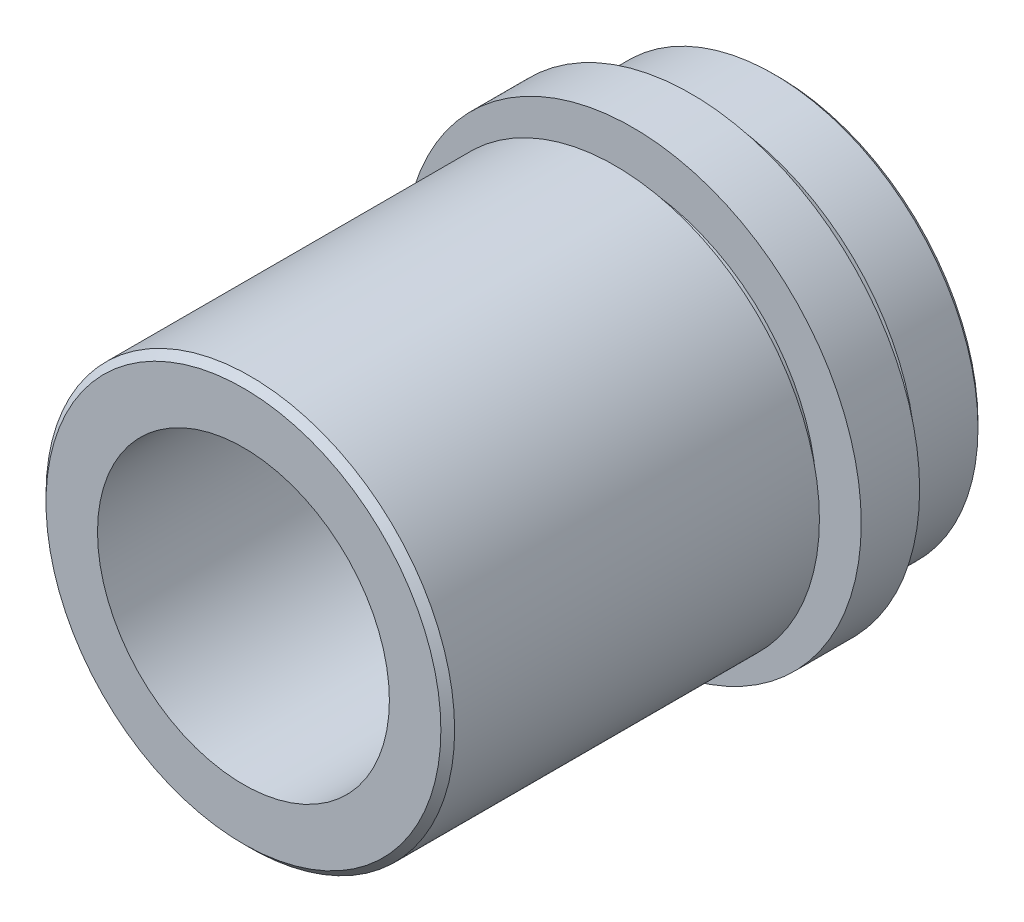
ISO-10303-21;
HEADER;
FILE_DESCRIPTION(('STEP AP214'),'2;1');
FILE_NAME('part.step','',(''),(''),'','','');
FILE_SCHEMA(('AUTOMOTIVE_DESIGN { 1 0 10303 214 1 1 1 1 }'));
ENDSEC;
DATA;
#1=APPLICATION_CONTEXT('core data for automotive mechanical design processes');
#2=APPLICATION_PROTOCOL_DEFINITION('international standard','automotive_design',2000,#1);
#3=PRODUCT_CONTEXT('',#1,'mechanical');
#4=PRODUCT('Part','Part','',(#3));
#5=PRODUCT_RELATED_PRODUCT_CATEGORY('part','',(#4));
#6=PRODUCT_DEFINITION_FORMATION('','',#4);
#7=PRODUCT_DEFINITION_CONTEXT('part definition',#1,'design');
#8=PRODUCT_DEFINITION('design','',#6,#7);
#9=PRODUCT_DEFINITION_SHAPE('','',#8);
#10=(LENGTH_UNIT() NAMED_UNIT(*) SI_UNIT(.MILLI.,.METRE.));
#11=(NAMED_UNIT(*) PLANE_ANGLE_UNIT() SI_UNIT($,.RADIAN.));
#12=(NAMED_UNIT(*) SI_UNIT($,.STERADIAN.) SOLID_ANGLE_UNIT());
#13=UNCERTAINTY_MEASURE_WITH_UNIT(LENGTH_MEASURE(1.E-05),#10,'distance_accuracy_value','');
#14=(GEOMETRIC_REPRESENTATION_CONTEXT(3) GLOBAL_UNCERTAINTY_ASSIGNED_CONTEXT((#13)) GLOBAL_UNIT_ASSIGNED_CONTEXT((#10,
#11,#12)) REPRESENTATION_CONTEXT('',''));
#15=CARTESIAN_POINT('',(0.,0.,0.));
#16=DIRECTION('',(0.,0.,1.));
#17=DIRECTION('',(1.,0.,0.));
#18=AXIS2_PLACEMENT_3D('',#15,#16,#17);
#19=CARTESIAN_POINT('',(0.,0.,0.));
#20=DIRECTION('',(0.,0.,1.));
#21=DIRECTION('',(1.,0.,0.));
#22=AXIS2_PLACEMENT_3D('',#19,#20,#21);
#23=CYLINDRICAL_SURFACE('',#22,21.);
#24=CARTESIAN_POINT('',(0.,0.,0.5));
#25=DIRECTION('',(0.,0.,1.));
#26=DIRECTION('',(1.,0.,0.));
#27=AXIS2_PLACEMENT_3D('',#24,#25,#26);
#28=CIRCLE('',#27,21.);
#29=CARTESIAN_POINT('',(21.,0.,0.5));
#30=VERTEX_POINT('',#29);
#31=EDGE_CURVE('E74',#30,#30,#28,.T.);
#32=ORIENTED_EDGE('',*,*,#31,.T.);
#33=EDGE_LOOP('',(#32));
#34=FACE_BOUND('',#33,.T.);
#35=CARTESIAN_POINT('',(0.,0.,6.9));
#36=DIRECTION('',(0.,0.,1.));
#37=DIRECTION('',(1.,0.,0.));
#38=AXIS2_PLACEMENT_3D('',#35,#36,#37);
#39=CIRCLE('',#38,21.);
#40=CARTESIAN_POINT('',(21.,0.,6.9));
#41=VERTEX_POINT('',#40);
#42=EDGE_CURVE('E83',#41,#41,#39,.T.);
#43=ORIENTED_EDGE('',*,*,#42,.F.);
#44=EDGE_LOOP('',(#43));
#45=FACE_BOUND('',#44,.T.);
#46=ADVANCED_FACE('F33',(#34,#45),#23,.T.);
#47=CARTESIAN_POINT('',(0.,21.,0.));
#48=DIRECTION('',(0.,0.,1.));
#49=DIRECTION('',(1.,0.,0.));
#50=AXIS2_PLACEMENT_3D('',#47,#48,#49);
#51=PLANE('',#50);
#52=CARTESIAN_POINT('',(0.,0.,0.));
#53=DIRECTION('',(0.,0.,1.));
#54=DIRECTION('',(1.,0.,0.));
#55=AXIS2_PLACEMENT_3D('',#52,#53,#54);
#56=CIRCLE('',#55,16.);
#57=CARTESIAN_POINT('',(16.,0.,0.));
#58=VERTEX_POINT('',#57);
#59=EDGE_CURVE('E68',#58,#58,#56,.T.);
#60=ORIENTED_EDGE('',*,*,#59,.T.);
#61=EDGE_LOOP('',(#60));
#62=FACE_BOUND('',#61,.T.);
#63=CARTESIAN_POINT('',(0.,0.,0.));
#64=DIRECTION('',(0.,0.,1.));
#65=DIRECTION('',(1.,0.,0.));
#66=AXIS2_PLACEMENT_3D('',#63,#64,#65);
#67=CIRCLE('',#66,20.5);
#68=CARTESIAN_POINT('',(20.5,0.,0.));
#69=VERTEX_POINT('',#68);
#70=EDGE_CURVE('E71',#69,#69,#67,.T.);
#71=ORIENTED_EDGE('',*,*,#70,.F.);
#72=EDGE_LOOP('',(#71));
#73=FACE_BOUND('',#72,.T.);
#74=ADVANCED_FACE('F91',(#62,#73),#51,.F.);
#75=CARTESIAN_POINT('',(0.,0.,55.));
#76=DIRECTION('',(0.,0.,-1.));
#77=DIRECTION('',(-1.,0.,0.));
#78=AXIS2_PLACEMENT_3D('',#75,#76,#77);
#79=PLANE('',#78);
#80=CARTESIAN_POINT('',(0.,0.,55.));
#81=DIRECTION('',(0.,0.,1.));
#82=DIRECTION('',(1.,0.,0.));
#83=AXIS2_PLACEMENT_3D('',#80,#81,#82);
#84=CIRCLE('',#83,20.2928932188134);
#85=CARTESIAN_POINT('',(20.2928932188134,0.,55.));
#86=VERTEX_POINT('',#85);
#87=EDGE_CURVE('E48',#86,#86,#84,.T.);
#88=ORIENTED_EDGE('',*,*,#87,.T.);
#89=EDGE_LOOP('',(#88));
#90=FACE_BOUND('',#89,.T.);
#91=CARTESIAN_POINT('',(0.,0.,55.));
#92=DIRECTION('',(0.,0.,1.));
#93=DIRECTION('',(1.,0.,0.));
#94=AXIS2_PLACEMENT_3D('',#91,#92,#93);
#95=CIRCLE('',#94,15.);
#96=CARTESIAN_POINT('',(15.,0.,55.));
#97=VERTEX_POINT('',#96);
#98=EDGE_CURVE('E62',#97,#97,#95,.T.);
#99=ORIENTED_EDGE('',*,*,#98,.F.);
#100=EDGE_LOOP('',(#99));
#101=FACE_BOUND('',#100,.T.);
#102=ADVANCED_FACE('F97',(#90,#101),#79,.F.);
#103=CARTESIAN_POINT('',(0.,23.5,9.));
#104=DIRECTION('',(0.,0.,1.));
#105=DIRECTION('',(1.,0.,0.));
#106=AXIS2_PLACEMENT_3D('',#103,#104,#105);
#107=PLANE('',#106);
#108=CARTESIAN_POINT('',(0.,0.,9.));
#109=DIRECTION('',(0.,0.,1.));
#110=DIRECTION('',(1.,0.,0.));
#111=AXIS2_PLACEMENT_3D('',#108,#109,#110);
#112=CIRCLE('',#111,23.5);
#113=CARTESIAN_POINT('',(23.5,0.,9.));
#114=VERTEX_POINT('',#113);
#115=EDGE_CURVE('E40',#114,#114,#112,.T.);
#116=ORIENTED_EDGE('',*,*,#115,.F.);
#117=EDGE_LOOP('',(#116));
#118=FACE_BOUND('',#117,.T.);
#119=CARTESIAN_POINT('',(0.,0.,9.));
#120=DIRECTION('',(0.,0.,1.));
#121=DIRECTION('',(1.,0.,0.));
#122=AXIS2_PLACEMENT_3D('',#119,#120,#121);
#123=CIRCLE('',#122,18.9);
#124=CARTESIAN_POINT('',(18.9,0.,9.));
#125=VERTEX_POINT('',#124);
#126=EDGE_CURVE('E77',#125,#125,#123,.T.);
#127=ORIENTED_EDGE('',*,*,#126,.T.);
#128=EDGE_LOOP('',(#127));
#129=FACE_BOUND('',#128,.T.);
#130=ADVANCED_FACE('F118',(#118,#129),#107,.F.);
#131=CARTESIAN_POINT('',(0.,0.,15.));
#132=DIRECTION('',(0.,0.,1.));
#133=DIRECTION('',(1.,0.,0.));
#134=AXIS2_PLACEMENT_3D('',#131,#132,#133);
#135=CYLINDRICAL_SURFACE('',#134,21.);
#136=CARTESIAN_POINT('',(0.,0.,54.2928932188135));
#137=DIRECTION('',(0.,0.,1.));
#138=DIRECTION('',(1.,0.,0.));
#139=AXIS2_PLACEMENT_3D('',#136,#137,#138);
#140=CIRCLE('',#139,21.);
#141=CARTESIAN_POINT('',(21.,0.,54.2928932188135));
#142=VERTEX_POINT('',#141);
#143=EDGE_CURVE('E44',#142,#142,#140,.T.);
#144=ORIENTED_EDGE('',*,*,#143,.F.);
#145=EDGE_LOOP('',(#144));
#146=FACE_BOUND('',#145,.T.);
#147=CARTESIAN_POINT('',(0.,0.,16.8));
#148=DIRECTION('',(0.,0.,1.));
#149=DIRECTION('',(1.,0.,0.));
#150=AXIS2_PLACEMENT_3D('',#147,#148,#149);
#151=CIRCLE('',#150,21.);
#152=CARTESIAN_POINT('',(21.,0.,16.8));
#153=VERTEX_POINT('',#152);
#154=EDGE_CURVE('E53',#153,#153,#151,.T.);
#155=ORIENTED_EDGE('',*,*,#154,.T.);
#156=EDGE_LOOP('',(#155));
#157=FACE_BOUND('',#156,.T.);
#158=ADVANCED_FACE('F114',(#146,#157),#135,.T.);
#159=CARTESIAN_POINT('',(0.,0.,55.));
#160=DIRECTION('',(0.,0.,-1.));
#161=DIRECTION('',(-1.,0.,0.));
#162=AXIS2_PLACEMENT_3D('',#159,#160,#161);
#163=CONICAL_SURFACE('',#162,20.2928932188134,0.785398163397463);
#164=ORIENTED_EDGE('',*,*,#143,.T.);
#165=EDGE_LOOP('',(#164));
#166=FACE_BOUND('',#165,.T.);
#167=ORIENTED_EDGE('',*,*,#87,.F.);
#168=EDGE_LOOP('',(#167));
#169=FACE_BOUND('',#168,.T.);
#170=ADVANCED_FACE('F110',(#166,#169),#163,.T.);
#171=CARTESIAN_POINT('',(0.,21.,16.8));
#172=DIRECTION('',(0.,0.,-1.));
#173=DIRECTION('',(-1.,0.,0.));
#174=AXIS2_PLACEMENT_3D('',#171,#172,#173);
#175=PLANE('',#174);
#176=CARTESIAN_POINT('',(0.,0.,16.8));
#177=DIRECTION('',(0.,0.,1.));
#178=DIRECTION('',(1.,0.,0.));
#179=AXIS2_PLACEMENT_3D('',#176,#177,#178);
#180=CIRCLE('',#179,18.9);
#181=CARTESIAN_POINT('',(18.9,0.,16.8));
#182=VERTEX_POINT('',#181);
#183=EDGE_CURVE('E56',#182,#182,#180,.T.);
#184=ORIENTED_EDGE('',*,*,#183,.T.);
#185=EDGE_LOOP('',(#184));
#186=FACE_BOUND('',#185,.T.);
#187=ORIENTED_EDGE('',*,*,#154,.F.);
#188=EDGE_LOOP('',(#187));
#189=FACE_BOUND('',#188,.T.);
#190=ADVANCED_FACE('F106',(#186,#189),#175,.T.);
#191=CARTESIAN_POINT('',(0.,0.,15.));
#192=DIRECTION('',(0.,0.,1.));
#193=DIRECTION('',(1.,0.,0.));
#194=AXIS2_PLACEMENT_3D('',#191,#192,#193);
#195=CYLINDRICAL_SURFACE('',#194,18.9);
#196=CARTESIAN_POINT('',(0.,0.,15.));
#197=DIRECTION('',(0.,0.,1.));
#198=DIRECTION('',(1.,0.,0.));
#199=AXIS2_PLACEMENT_3D('',#196,#197,#198);
#200=CIRCLE('',#199,18.9);
#201=CARTESIAN_POINT('',(18.9,0.,15.));
#202=VERTEX_POINT('',#201);
#203=EDGE_CURVE('E59',#202,#202,#200,.T.);
#204=ORIENTED_EDGE('',*,*,#203,.T.);
#205=EDGE_LOOP('',(#204));
#206=FACE_BOUND('',#205,.T.);
#207=ORIENTED_EDGE('',*,*,#183,.F.);
#208=EDGE_LOOP('',(#207));
#209=FACE_BOUND('',#208,.T.);
#210=ADVANCED_FACE('F102',(#206,#209),#195,.T.);
#211=CARTESIAN_POINT('',(0.,0.,9.));
#212=DIRECTION('',(0.,0.,1.));
#213=DIRECTION('',(1.,0.,0.));
#214=AXIS2_PLACEMENT_3D('',#211,#212,#213);
#215=CYLINDRICAL_SURFACE('',#214,23.5);
#216=CARTESIAN_POINT('',(0.,0.,15.));
#217=DIRECTION('',(0.,0.,1.));
#218=DIRECTION('',(1.,0.,0.));
#219=AXIS2_PLACEMENT_3D('',#216,#217,#218);
#220=CIRCLE('',#219,23.5);
#221=CARTESIAN_POINT('',(23.5,0.,15.));
#222=VERTEX_POINT('',#221);
#223=EDGE_CURVE('E10',#222,#222,#220,.T.);
#224=ORIENTED_EDGE('',*,*,#223,.F.);
#225=EDGE_LOOP('',(#224));
#226=FACE_BOUND('',#225,.T.);
#227=ORIENTED_EDGE('',*,*,#115,.T.);
#228=EDGE_LOOP('',(#227));
#229=FACE_BOUND('',#228,.T.);
#230=ADVANCED_FACE('F105',(#226,#229),#215,.T.);
#231=CARTESIAN_POINT('',(0.,0.,15.));
#232=DIRECTION('',(0.,0.,-1.));
#233=DIRECTION('',(-1.,0.,0.));
#234=AXIS2_PLACEMENT_3D('',#231,#232,#233);
#235=PLANE('',#234);
#236=ORIENTED_EDGE('',*,*,#223,.T.);
#237=EDGE_LOOP('',(#236));
#238=FACE_BOUND('',#237,.T.);
#239=ORIENTED_EDGE('',*,*,#203,.F.);
#240=EDGE_LOOP('',(#239));
#241=FACE_BOUND('',#240,.T.);
#242=ADVANCED_FACE('F35',(#238,#241),#235,.F.);
#243=CARTESIAN_POINT('',(0.,0.,0.));
#244=DIRECTION('',(0.,0.,1.));
#245=DIRECTION('',(1.,0.,0.));
#246=AXIS2_PLACEMENT_3D('',#243,#244,#245);
#247=CYLINDRICAL_SURFACE('',#246,15.);
#248=ORIENTED_EDGE('',*,*,#98,.T.);
#249=EDGE_LOOP('',(#248));
#250=FACE_BOUND('',#249,.T.);
#251=CARTESIAN_POINT('',(0.,0.,1.));
#252=DIRECTION('',(0.,0.,1.));
#253=DIRECTION('',(1.,0.,0.));
#254=AXIS2_PLACEMENT_3D('',#251,#252,#253);
#255=CIRCLE('',#254,15.);
#256=CARTESIAN_POINT('',(15.,0.,1.));
#257=VERTEX_POINT('',#256);
#258=EDGE_CURVE('E65',#257,#257,#255,.T.);
#259=ORIENTED_EDGE('',*,*,#258,.F.);
#260=EDGE_LOOP('',(#259));
#261=FACE_BOUND('',#260,.T.);
#262=ADVANCED_FACE('F130',(#250,#261),#247,.F.);
#263=CARTESIAN_POINT('',(0.,0.,0.));
#264=DIRECTION('',(0.,0.,-1.));
#265=DIRECTION('',(-1.,0.,0.));
#266=AXIS2_PLACEMENT_3D('',#263,#264,#265);
#267=CONICAL_SURFACE('',#266,16.,0.785398163397449);
#268=ORIENTED_EDGE('',*,*,#258,.T.);
#269=EDGE_LOOP('',(#268));
#270=FACE_BOUND('',#269,.T.);
#271=ORIENTED_EDGE('',*,*,#59,.F.);
#272=EDGE_LOOP('',(#271));
#273=FACE_BOUND('',#272,.T.);
#274=ADVANCED_FACE('F134',(#270,#273),#267,.F.);
#275=CARTESIAN_POINT('',(0.,0.,0.5));
#276=DIRECTION('',(0.,0.,1.));
#277=DIRECTION('',(1.,0.,0.));
#278=AXIS2_PLACEMENT_3D('',#275,#276,#277);
#279=CONICAL_SURFACE('',#278,21.,0.785398163397449);
#280=ORIENTED_EDGE('',*,*,#70,.T.);
#281=EDGE_LOOP('',(#280));
#282=FACE_BOUND('',#281,.T.);
#283=ORIENTED_EDGE('',*,*,#31,.F.);
#284=EDGE_LOOP('',(#283));
#285=FACE_BOUND('',#284,.T.);
#286=ADVANCED_FACE('F146',(#282,#285),#279,.T.);
#287=CARTESIAN_POINT('',(0.,0.,0.));
#288=DIRECTION('',(0.,0.,1.));
#289=DIRECTION('',(1.,0.,0.));
#290=AXIS2_PLACEMENT_3D('',#287,#288,#289);
#291=CYLINDRICAL_SURFACE('',#290,18.9);
#292=CARTESIAN_POINT('',(0.,0.,6.9));
#293=DIRECTION('',(0.,0.,1.));
#294=DIRECTION('',(1.,0.,0.));
#295=AXIS2_PLACEMENT_3D('',#292,#293,#294);
#296=CIRCLE('',#295,18.9);
#297=CARTESIAN_POINT('',(18.9,0.,6.9));
#298=VERTEX_POINT('',#297);
#299=EDGE_CURVE('E80',#298,#298,#296,.T.);
#300=ORIENTED_EDGE('',*,*,#299,.T.);
#301=EDGE_LOOP('',(#300));
#302=FACE_BOUND('',#301,.T.);
#303=ORIENTED_EDGE('',*,*,#126,.F.);
#304=EDGE_LOOP('',(#303));
#305=FACE_BOUND('',#304,.T.);
#306=ADVANCED_FACE('F153',(#302,#305),#291,.T.);
#307=CARTESIAN_POINT('',(0.,18.9,6.9));
#308=DIRECTION('',(0.,0.,1.));
#309=DIRECTION('',(1.,0.,0.));
#310=AXIS2_PLACEMENT_3D('',#307,#308,#309);
#311=PLANE('',#310);
#312=ORIENTED_EDGE('',*,*,#42,.T.);
#313=EDGE_LOOP('',(#312));
#314=FACE_BOUND('',#313,.T.);
#315=ORIENTED_EDGE('',*,*,#299,.F.);
#316=EDGE_LOOP('',(#315));
#317=FACE_BOUND('',#316,.T.);
#318=ADVANCED_FACE('F87',(#314,#317),#311,.T.);
#319=CLOSED_SHELL('',(#46,#74,#102,#130,#158,#170,#190,#210,#230,#242,#262,#274,#286,#306,#318));
#320=MANIFOLD_SOLID_BREP('B2',#319);
#321=ADVANCED_BREP_SHAPE_REPRESENTATION('',(#18,#320),#14);
#322=SHAPE_DEFINITION_REPRESENTATION(#9,#321);
ENDSEC;
END-ISO-10303-21;
